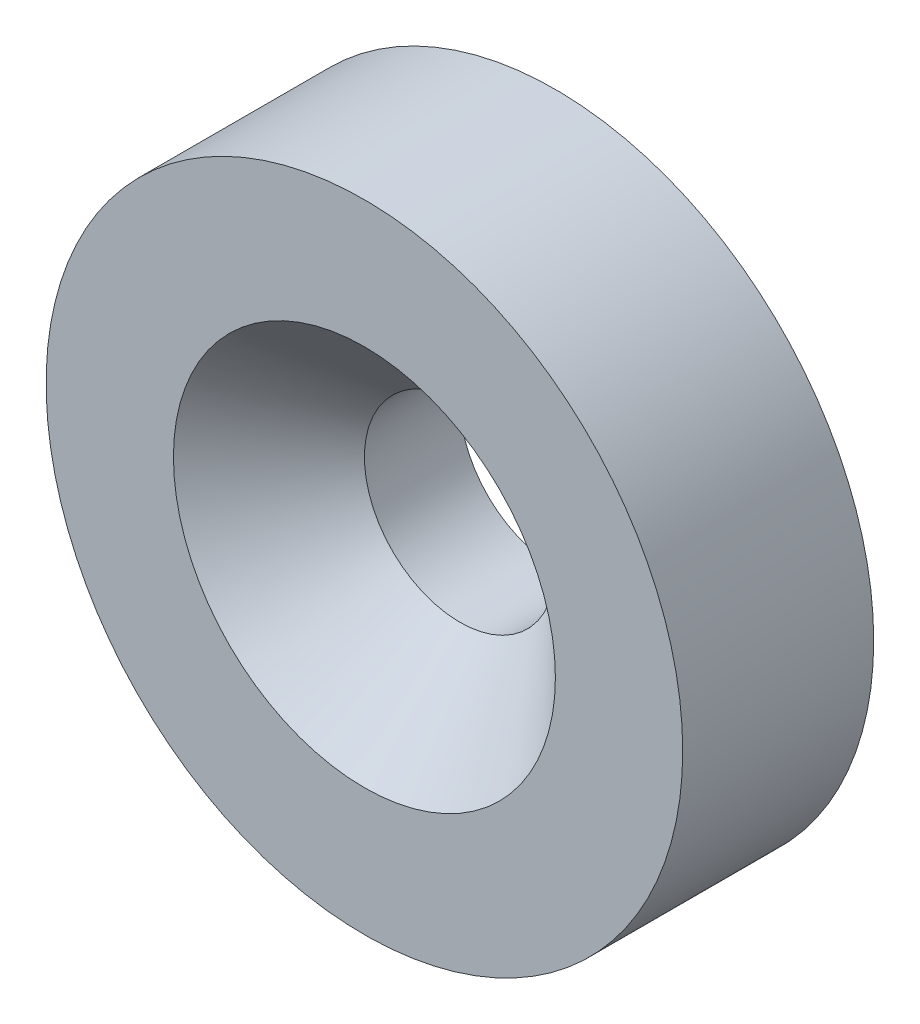
ISO-10303-21;
HEADER;
FILE_DESCRIPTION(('STEP AP214'),'2;1');
FILE_NAME('part.step','',(''),(''),'','','');
FILE_SCHEMA(('AUTOMOTIVE_DESIGN { 1 0 10303 214 1 1 1 1 }'));
ENDSEC;
DATA;
#1=APPLICATION_CONTEXT('core data for automotive mechanical design processes');
#2=APPLICATION_PROTOCOL_DEFINITION('international standard','automotive_design',2000,#1);
#3=PRODUCT_CONTEXT('',#1,'mechanical');
#4=PRODUCT('Part','Part','',(#3));
#5=PRODUCT_RELATED_PRODUCT_CATEGORY('part','',(#4));
#6=PRODUCT_DEFINITION_FORMATION('','',#4);
#7=PRODUCT_DEFINITION_CONTEXT('part definition',#1,'design');
#8=PRODUCT_DEFINITION('design','',#6,#7);
#9=PRODUCT_DEFINITION_SHAPE('','',#8);
#10=(LENGTH_UNIT() NAMED_UNIT(*) SI_UNIT(.MILLI.,.METRE.));
#11=(NAMED_UNIT(*) PLANE_ANGLE_UNIT() SI_UNIT($,.RADIAN.));
#12=(NAMED_UNIT(*) SI_UNIT($,.STERADIAN.) SOLID_ANGLE_UNIT());
#13=UNCERTAINTY_MEASURE_WITH_UNIT(LENGTH_MEASURE(1.E-05),#10,'distance_accuracy_value','');
#14=(GEOMETRIC_REPRESENTATION_CONTEXT(3) GLOBAL_UNCERTAINTY_ASSIGNED_CONTEXT((#13)) GLOBAL_UNIT_ASSIGNED_CONTEXT((#10,
#11,#12)) REPRESENTATION_CONTEXT('',''));
#15=CARTESIAN_POINT('',(0.,0.,0.));
#16=DIRECTION('',(0.,0.,1.));
#17=DIRECTION('',(1.,0.,0.));
#18=AXIS2_PLACEMENT_3D('',#15,#16,#17);
#19=CARTESIAN_POINT('',(0.,0.,3.));
#20=DIRECTION('',(0.,0.,1.));
#21=DIRECTION('',(1.,0.,0.));
#22=AXIS2_PLACEMENT_3D('',#19,#20,#21);
#23=PLANE('',#22);
#24=CARTESIAN_POINT('',(0.,0.,3.));
#25=DIRECTION('',(0.,0.,1.));
#26=DIRECTION('',(1.,0.,0.));
#27=AXIS2_PLACEMENT_3D('',#24,#25,#26);
#28=CIRCLE('',#27,3.00000000000001);
#29=CARTESIAN_POINT('',(3.00000000000001,0.,3.));
#30=VERTEX_POINT('',#29);
#31=EDGE_CURVE('E10',#30,#30,#28,.F.);
#32=ORIENTED_EDGE('',*,*,#31,.T.);
#33=EDGE_LOOP('',(#32));
#34=FACE_BOUND('',#33,.T.);
#35=CARTESIAN_POINT('',(0.,0.,3.));
#36=DIRECTION('',(0.,0.,1.));
#37=DIRECTION('',(1.,0.,0.));
#38=AXIS2_PLACEMENT_3D('',#35,#36,#37);
#39=CIRCLE('',#38,5.);
#40=CARTESIAN_POINT('',(5.,0.,3.));
#41=VERTEX_POINT('',#40);
#42=EDGE_CURVE('E51',#41,#41,#39,.T.);
#43=ORIENTED_EDGE('',*,*,#42,.T.);
#44=EDGE_LOOP('',(#43));
#45=FACE_BOUND('',#44,.T.);
#46=ADVANCED_FACE('F37',(#34,#45),#23,.T.);
#47=CARTESIAN_POINT('',(0.,0.,0.));
#48=DIRECTION('',(0.,0.,1.));
#49=DIRECTION('',(1.,0.,0.));
#50=AXIS2_PLACEMENT_3D('',#47,#48,#49);
#51=PLANE('',#50);
#52=CARTESIAN_POINT('',(0.,0.,0.));
#53=DIRECTION('',(0.,0.,1.));
#54=DIRECTION('',(1.,0.,0.));
#55=AXIS2_PLACEMENT_3D('',#52,#53,#54);
#56=CIRCLE('',#55,5.);
#57=CARTESIAN_POINT('',(5.,0.,0.));
#58=VERTEX_POINT('',#57);
#59=EDGE_CURVE('E56',#58,#58,#56,.T.);
#60=ORIENTED_EDGE('',*,*,#59,.F.);
#61=EDGE_LOOP('',(#60));
#62=FACE_BOUND('',#61,.T.);
#63=CARTESIAN_POINT('',(0.,0.,0.));
#64=DIRECTION('',(0.,0.,1.));
#65=DIRECTION('',(1.,0.,0.));
#66=AXIS2_PLACEMENT_3D('',#63,#64,#65);
#67=CIRCLE('',#66,1.5);
#68=CARTESIAN_POINT('',(1.5,0.,0.));
#69=VERTEX_POINT('',#68);
#70=EDGE_CURVE('E61',#69,#69,#67,.T.);
#71=ORIENTED_EDGE('',*,*,#70,.T.);
#72=EDGE_LOOP('',(#71));
#73=FACE_BOUND('',#72,.T.);
#74=ADVANCED_FACE('F67',(#62,#73),#51,.F.);
#75=CARTESIAN_POINT('',(0.,0.,3.));
#76=DIRECTION('',(0.,0.,-1.));
#77=DIRECTION('',(-1.,0.,0.));
#78=AXIS2_PLACEMENT_3D('',#75,#76,#77);
#79=CYLINDRICAL_SURFACE('',#78,5.);
#80=ORIENTED_EDGE('',*,*,#42,.F.);
#81=EDGE_LOOP('',(#80));
#82=FACE_BOUND('',#81,.T.);
#83=ORIENTED_EDGE('',*,*,#59,.T.);
#84=EDGE_LOOP('',(#83));
#85=FACE_BOUND('',#84,.T.);
#86=ADVANCED_FACE('F71',(#82,#85),#79,.T.);
#87=CARTESIAN_POINT('',(0.,0.,3.));
#88=DIRECTION('',(0.,0.,-1.));
#89=DIRECTION('',(-1.,0.,0.));
#90=AXIS2_PLACEMENT_3D('',#87,#88,#89);
#91=CYLINDRICAL_SURFACE('',#90,1.5);
#92=CARTESIAN_POINT('',(0.,0.,1.5));
#93=DIRECTION('',(0.,0.,1.));
#94=DIRECTION('',(1.,0.,0.));
#95=AXIS2_PLACEMENT_3D('',#92,#93,#94);
#96=CIRCLE('',#95,1.5);
#97=CARTESIAN_POINT('',(1.5,0.,1.5));
#98=VERTEX_POINT('',#97);
#99=EDGE_CURVE('E46',#98,#98,#96,.T.);
#100=ORIENTED_EDGE('',*,*,#99,.T.);
#101=EDGE_LOOP('',(#100));
#102=FACE_BOUND('',#101,.T.);
#103=ORIENTED_EDGE('',*,*,#70,.F.);
#104=EDGE_LOOP('',(#103));
#105=FACE_BOUND('',#104,.T.);
#106=ADVANCED_FACE('F69',(#102,#105),#91,.F.);
#107=CARTESIAN_POINT('',(0.,0.,1.5));
#108=DIRECTION('',(0.,0.,1.));
#109=DIRECTION('',(1.,0.,0.));
#110=AXIS2_PLACEMENT_3D('',#107,#108,#109);
#111=CONICAL_SURFACE('',#110,1.5,0.78539816339745);
#112=ORIENTED_EDGE('',*,*,#31,.F.);
#113=EDGE_LOOP('',(#112));
#114=FACE_BOUND('',#113,.T.);
#115=ORIENTED_EDGE('',*,*,#99,.F.);
#116=EDGE_LOOP('',(#115));
#117=FACE_BOUND('',#116,.T.);
#118=ADVANCED_FACE('F40',(#114,#117),#111,.F.);
#119=CLOSED_SHELL('',(#46,#74,#86,#106,#118));
#120=MANIFOLD_SOLID_BREP('B2',#119);
#121=ADVANCED_BREP_SHAPE_REPRESENTATION('',(#18,#120),#14);
#122=SHAPE_DEFINITION_REPRESENTATION(#9,#121);
ENDSEC;
END-ISO-10303-21;
